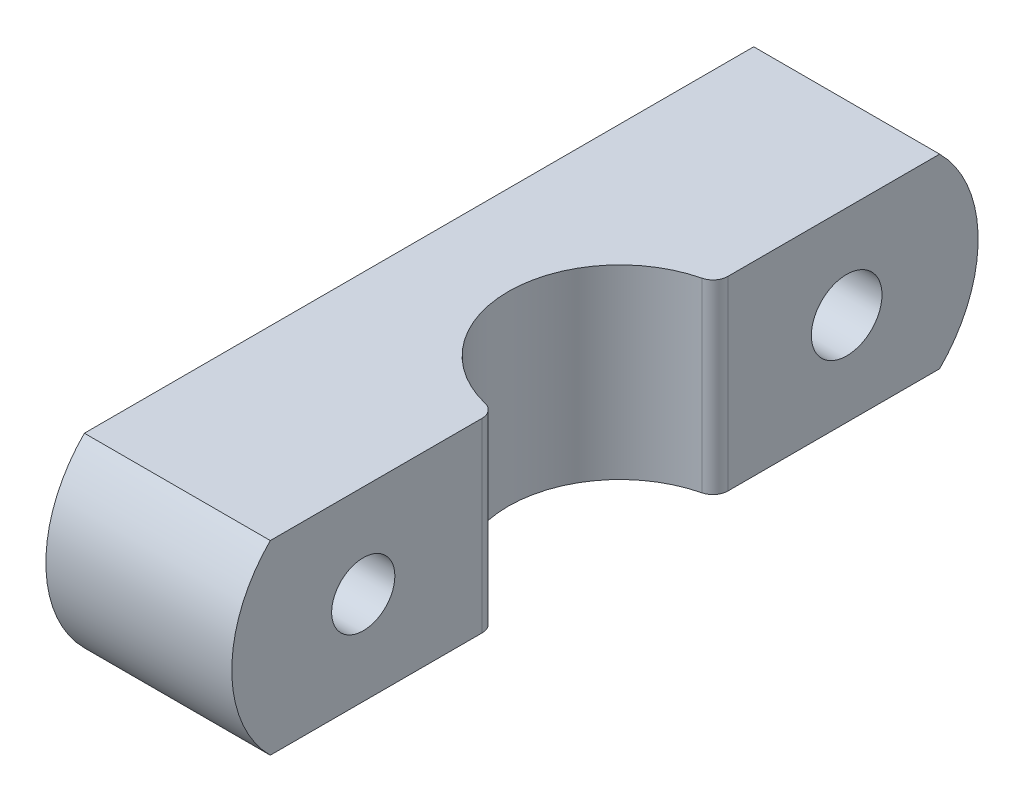
ISO-10303-21;
HEADER;
FILE_DESCRIPTION(('STEP AP214'),'2;1');
FILE_NAME('part.step','',(''),(''),'','','');
FILE_SCHEMA(('AUTOMOTIVE_DESIGN { 1 0 10303 214 1 1 1 1 }'));
ENDSEC;
DATA;
#1=APPLICATION_CONTEXT('core data for automotive mechanical design processes');
#2=APPLICATION_PROTOCOL_DEFINITION('international standard','automotive_design',2000,#1);
#3=PRODUCT_CONTEXT('',#1,'mechanical');
#4=PRODUCT('Part','Part','',(#3));
#5=PRODUCT_RELATED_PRODUCT_CATEGORY('part','',(#4));
#6=PRODUCT_DEFINITION_FORMATION('','',#4);
#7=PRODUCT_DEFINITION_CONTEXT('part definition',#1,'design');
#8=PRODUCT_DEFINITION('design','',#6,#7);
#9=PRODUCT_DEFINITION_SHAPE('','',#8);
#10=(LENGTH_UNIT() NAMED_UNIT(*) SI_UNIT(.MILLI.,.METRE.));
#11=(NAMED_UNIT(*) PLANE_ANGLE_UNIT() SI_UNIT($,.RADIAN.));
#12=(NAMED_UNIT(*) SI_UNIT($,.STERADIAN.) SOLID_ANGLE_UNIT());
#13=UNCERTAINTY_MEASURE_WITH_UNIT(LENGTH_MEASURE(1.E-05),#10,'distance_accuracy_value','');
#14=(GEOMETRIC_REPRESENTATION_CONTEXT(3) GLOBAL_UNCERTAINTY_ASSIGNED_CONTEXT((#13)) GLOBAL_UNIT_ASSIGNED_CONTEXT((#10,
#11,#12)) REPRESENTATION_CONTEXT('',''));
#15=CARTESIAN_POINT('',(0.,0.,0.));
#16=DIRECTION('',(0.,0.,1.));
#17=DIRECTION('',(1.,0.,0.));
#18=AXIS2_PLACEMENT_3D('',#15,#16,#17);
#19=CARTESIAN_POINT('',(10.,11.4117982626734,16.8358985756885));
#20=DIRECTION('',(1.,0.,0.));
#21=DIRECTION('',(0.,0.,-1.));
#22=AXIS2_PLACEMENT_3D('',#19,#20,#21);
#23=PLANE('',#22);
#24=CARTESIAN_POINT('',(10.,11.4117982626734,16.8358985756885));
#25=DIRECTION('',(1.,0.,0.));
#26=DIRECTION('',(0.,0.,-1.));
#27=AXIS2_PLACEMENT_3D('',#24,#25,#26);
#28=CIRCLE('',#27,1.7);
#29=CARTESIAN_POINT('',(10.,11.4117982626734,15.1358985756885));
#30=VERTEX_POINT('',#29);
#31=EDGE_CURVE('E237',#30,#30,#28,.T.);
#32=ORIENTED_EDGE('',*,*,#31,.F.);
#33=EDGE_LOOP('',(#32));
#34=FACE_BOUND('',#33,.T.);
#35=DIRECTION('',(0.,0.,-1.));
#36=VECTOR('',#35,1.);
#37=CARTESIAN_POINT('',(10.,6.41179826267341,21.8358985756885));
#38=LINE('',#37,#36);
#39=CARTESIAN_POINT('',(10.,6.41179826267341,21.8358985756885));
#40=VERTEX_POINT('',#39);
#41=CARTESIAN_POINT('',(10.,6.41179826267341,10.4449832324319));
#42=VERTEX_POINT('',#41);
#43=EDGE_CURVE('E167',#40,#42,#38,.T.);
#44=ORIENTED_EDGE('',*,*,#43,.T.);
#45=DIRECTION('',(0.,1.,0.));
#46=VECTOR('',#45,1.);
#47=CARTESIAN_POINT('',(10.,16.4117982626734,10.4449832324319));
#48=LINE('',#47,#46);
#49=CARTESIAN_POINT('',(10.,16.4117982626734,10.4449832324319));
#50=VERTEX_POINT('',#49);
#51=EDGE_CURVE('E62',#42,#50,#48,.T.);
#52=ORIENTED_EDGE('',*,*,#51,.T.);
#53=DIRECTION('',(0.,0.,1.));
#54=VECTOR('',#53,1.);
#55=CARTESIAN_POINT('',(10.,16.4117982626734,10.6358985756885));
#56=LINE('',#55,#54);
#57=CARTESIAN_POINT('',(10.,16.4117982626734,21.8358985756885));
#58=VERTEX_POINT('',#57);
#59=EDGE_CURVE('E103',#50,#58,#56,.T.);
#60=ORIENTED_EDGE('',*,*,#59,.T.);
#61=CARTESIAN_POINT('',(10.,11.4117982626734,16.8358985756885));
#62=DIRECTION('',(1.,0.,0.));
#63=DIRECTION('',(0.,0.,-1.));
#64=AXIS2_PLACEMENT_3D('',#61,#62,#63);
#65=CIRCLE('',#64,7.07106781186548);
#66=EDGE_CURVE('E105',#58,#40,#65,.T.);
#67=ORIENTED_EDGE('',*,*,#66,.T.);
#68=EDGE_LOOP('',(#44,#52,#60,#67));
#69=FACE_BOUND('',#68,.T.);
#70=ADVANCED_FACE('F38',(#34,#69),#23,.T.);
#71=CARTESIAN_POINT('',(10.,11.4117982626734,16.8358985756885));
#72=DIRECTION('',(-1.,0.,0.));
#73=DIRECTION('',(0.,0.,1.));
#74=AXIS2_PLACEMENT_3D('',#71,#72,#73);
#75=CYLINDRICAL_SURFACE('',#74,7.07106781186548);
#76=CARTESIAN_POINT('',(0.,11.4117982626734,16.8358985756885));
#77=DIRECTION('',(1.,0.,0.));
#78=DIRECTION('',(0.,0.,-1.));
#79=AXIS2_PLACEMENT_3D('',#76,#77,#78);
#80=CIRCLE('',#79,7.07106781186548);
#81=CARTESIAN_POINT('',(0.,16.4117982626734,21.8358985756885));
#82=VERTEX_POINT('',#81);
#83=CARTESIAN_POINT('',(0.,6.41179826267341,21.8358985756885));
#84=VERTEX_POINT('',#83);
#85=EDGE_CURVE('E161',#82,#84,#80,.T.);
#86=ORIENTED_EDGE('',*,*,#85,.T.);
#87=DIRECTION('',(-1.,0.,0.));
#88=VECTOR('',#87,1.);
#89=CARTESIAN_POINT('',(10.,6.41179826267341,21.8358985756885));
#90=LINE('',#89,#88);
#91=EDGE_CURVE('E119',#40,#84,#90,.T.);
#92=ORIENTED_EDGE('',*,*,#91,.F.);
#93=ORIENTED_EDGE('',*,*,#66,.F.);
#94=DIRECTION('',(-1.,0.,0.));
#95=VECTOR('',#94,1.);
#96=CARTESIAN_POINT('',(10.,16.4117982626734,21.8358985756885));
#97=LINE('',#96,#95);
#98=EDGE_CURVE('E117',#58,#82,#97,.T.);
#99=ORIENTED_EDGE('',*,*,#98,.T.);
#100=EDGE_LOOP('',(#86,#92,#93,#99));
#101=FACE_BOUND('',#100,.T.);
#102=ADVANCED_FACE('F116',(#101),#75,.T.);
#103=CARTESIAN_POINT('',(10.,6.41179826267341,-2.96410142431147));
#104=DIRECTION('',(0.,1.,0.));
#105=DIRECTION('',(0.,0.,1.));
#106=AXIS2_PLACEMENT_3D('',#103,#104,#105);
#107=PLANE('',#106);
#108=CARTESIAN_POINT('',(10.8,6.41179826267341,3.83589857568853));
#109=DIRECTION('',(0.,-1.,0.));
#110=DIRECTION('',(0.,0.,-1.));
#111=AXIS2_PLACEMENT_3D('',#108,#109,#110);
#112=CIRCLE('',#111,6.);
#113=CARTESIAN_POINT('',(9.38823529411765,6.41179826267341,9.66744386105028));
#114=VERTEX_POINT('',#113);
#115=CARTESIAN_POINT('',(9.38823529411765,6.41179826267341,-1.99564670967323));
#116=VERTEX_POINT('',#115);
#117=EDGE_CURVE('E162',#114,#116,#112,.T.);
#118=ORIENTED_EDGE('',*,*,#117,.F.);
#119=CARTESIAN_POINT('',(9.2,6.41179826267341,10.4449832324319));
#120=DIRECTION('',(0.,1.,0.));
#121=DIRECTION('',(0.,0.,1.));
#122=AXIS2_PLACEMENT_3D('',#119,#120,#121);
#123=CIRCLE('',#122,0.8);
#124=EDGE_CURVE('E144',#114,#42,#123,.F.);
#125=ORIENTED_EDGE('',*,*,#124,.T.);
#126=ORIENTED_EDGE('',*,*,#43,.F.);
#127=ORIENTED_EDGE('',*,*,#91,.T.);
#128=DIRECTION('',(0.,0.,-1.));
#129=VECTOR('',#128,1.);
#130=CARTESIAN_POINT('',(0.,6.41179826267341,-2.96410142431147));
#131=LINE('',#130,#129);
#132=CARTESIAN_POINT('',(0.,6.41179826267341,-14.1641014243115));
#133=VERTEX_POINT('',#132);
#134=EDGE_CURVE('E179',#84,#133,#131,.T.);
#135=ORIENTED_EDGE('',*,*,#134,.T.);
#136=DIRECTION('',(-1.,0.,0.));
#137=VECTOR('',#136,1.);
#138=CARTESIAN_POINT('',(10.,6.41179826267341,-14.1641014243115));
#139=LINE('',#138,#137);
#140=CARTESIAN_POINT('',(10.,6.41179826267341,-14.1641014243115));
#141=VERTEX_POINT('',#140);
#142=EDGE_CURVE('E134',#141,#133,#139,.T.);
#143=ORIENTED_EDGE('',*,*,#142,.F.);
#144=CARTESIAN_POINT('',(10.,6.41179826267341,-2.7731860810548));
#145=VERTEX_POINT('',#144);
#146=EDGE_CURVE('E122',#145,#141,#38,.T.);
#147=ORIENTED_EDGE('',*,*,#146,.F.);
#148=CARTESIAN_POINT('',(9.2,6.41179826267341,-2.77318608105479));
#149=DIRECTION('',(0.,1.,0.));
#150=DIRECTION('',(0.,0.,1.));
#151=AXIS2_PLACEMENT_3D('',#148,#149,#150);
#152=CIRCLE('',#151,0.8);
#153=EDGE_CURVE('E141',#145,#116,#152,.F.);
#154=ORIENTED_EDGE('',*,*,#153,.T.);
#155=EDGE_LOOP('',(#118,#125,#126,#127,#135,#143,#147,#154));
#156=FACE_BOUND('',#155,.T.);
#157=ADVANCED_FACE('F166',(#156),#107,.F.);
#158=CARTESIAN_POINT('',(10.,11.4117982626734,-9.16410142431147));
#159=DIRECTION('',(-1.,0.,0.));
#160=DIRECTION('',(0.,0.,1.));
#161=AXIS2_PLACEMENT_3D('',#158,#159,#160);
#162=CYLINDRICAL_SURFACE('',#161,7.07106781186548);
#163=CARTESIAN_POINT('',(0.,11.4117982626734,-9.16410142431147));
#164=DIRECTION('',(1.,0.,0.));
#165=DIRECTION('',(0.,0.,-1.));
#166=AXIS2_PLACEMENT_3D('',#163,#164,#165);
#167=CIRCLE('',#166,7.07106781186548);
#168=CARTESIAN_POINT('',(0.,16.4117982626734,-14.1641014243115));
#169=VERTEX_POINT('',#168);
#170=EDGE_CURVE('E182',#133,#169,#167,.T.);
#171=ORIENTED_EDGE('',*,*,#170,.T.);
#172=DIRECTION('',(-1.,0.,0.));
#173=VECTOR('',#172,1.);
#174=CARTESIAN_POINT('',(10.,16.4117982626734,-14.1641014243115));
#175=LINE('',#174,#173);
#176=CARTESIAN_POINT('',(10.,16.4117982626734,-14.1641014243115));
#177=VERTEX_POINT('',#176);
#178=EDGE_CURVE('E174',#177,#169,#175,.T.);
#179=ORIENTED_EDGE('',*,*,#178,.F.);
#180=CARTESIAN_POINT('',(10.,11.4117982626734,-9.16410142431147));
#181=DIRECTION('',(1.,0.,0.));
#182=DIRECTION('',(0.,0.,-1.));
#183=AXIS2_PLACEMENT_3D('',#180,#181,#182);
#184=CIRCLE('',#183,7.07106781186548);
#185=EDGE_CURVE('E169',#141,#177,#184,.T.);
#186=ORIENTED_EDGE('',*,*,#185,.F.);
#187=ORIENTED_EDGE('',*,*,#142,.T.);
#188=EDGE_LOOP('',(#171,#179,#186,#187));
#189=FACE_BOUND('',#188,.T.);
#190=ADVANCED_FACE('F195',(#189),#162,.T.);
#191=CARTESIAN_POINT('',(10.,16.4117982626734,10.6358985756885));
#192=DIRECTION('',(0.,1.,0.));
#193=DIRECTION('',(0.,0.,1.));
#194=AXIS2_PLACEMENT_3D('',#191,#192,#193);
#195=PLANE('',#194);
#196=ORIENTED_EDGE('',*,*,#59,.F.);
#197=CARTESIAN_POINT('',(9.2,16.4117982626734,10.4449832324319));
#198=DIRECTION('',(0.,1.,0.));
#199=DIRECTION('',(0.,0.,1.));
#200=AXIS2_PLACEMENT_3D('',#197,#198,#199);
#201=CIRCLE('',#200,0.8);
#202=CARTESIAN_POINT('',(9.38823529411765,16.4117982626734,9.66744386105028));
#203=VERTEX_POINT('',#202);
#204=EDGE_CURVE('E47',#50,#203,#201,.T.);
#205=ORIENTED_EDGE('',*,*,#204,.T.);
#206=CARTESIAN_POINT('',(10.8,16.4117982626734,3.83589857568853));
#207=DIRECTION('',(0.,-1.,0.));
#208=DIRECTION('',(0.,0.,-1.));
#209=AXIS2_PLACEMENT_3D('',#206,#207,#208);
#210=CIRCLE('',#209,6.);
#211=CARTESIAN_POINT('',(9.38823529411765,16.4117982626734,-1.99564670967323));
#212=VERTEX_POINT('',#211);
#213=EDGE_CURVE('E152',#203,#212,#210,.T.);
#214=ORIENTED_EDGE('',*,*,#213,.T.);
#215=CARTESIAN_POINT('',(9.2,16.4117982626734,-2.77318608105479));
#216=DIRECTION('',(0.,1.,0.));
#217=DIRECTION('',(0.,0.,1.));
#218=AXIS2_PLACEMENT_3D('',#215,#216,#217);
#219=CIRCLE('',#218,0.8);
#220=CARTESIAN_POINT('',(10.,16.4117982626734,-2.77318608105479));
#221=VERTEX_POINT('',#220);
#222=EDGE_CURVE('E54',#212,#221,#219,.T.);
#223=ORIENTED_EDGE('',*,*,#222,.T.);
#224=EDGE_CURVE('E110',#177,#221,#56,.T.);
#225=ORIENTED_EDGE('',*,*,#224,.F.);
#226=ORIENTED_EDGE('',*,*,#178,.T.);
#227=DIRECTION('',(0.,0.,-1.));
#228=VECTOR('',#227,1.);
#229=CARTESIAN_POINT('',(0.,16.4117982626734,10.6358985756885));
#230=LINE('',#229,#228);
#231=EDGE_CURVE('E111',#82,#169,#230,.T.);
#232=ORIENTED_EDGE('',*,*,#231,.F.);
#233=ORIENTED_EDGE('',*,*,#98,.F.);
#234=EDGE_LOOP('',(#196,#205,#214,#223,#225,#226,#232,#233));
#235=FACE_BOUND('',#234,.T.);
#236=ADVANCED_FACE('F124',(#235),#195,.T.);
#237=CARTESIAN_POINT('',(10.,11.4117982626734,-9.16410142431147));
#238=DIRECTION('',(1.,0.,0.));
#239=DIRECTION('',(0.,0.,-1.));
#240=AXIS2_PLACEMENT_3D('',#237,#238,#239);
#241=CIRCLE('',#240,1.90000000000001);
#242=CARTESIAN_POINT('',(10.,11.4117982626734,-11.0641014243115));
#243=VERTEX_POINT('',#242);
#244=EDGE_CURVE('E245',#243,#243,#241,.T.);
#245=ORIENTED_EDGE('',*,*,#244,.F.);
#246=EDGE_LOOP('',(#245));
#247=FACE_BOUND('',#246,.T.);
#248=ORIENTED_EDGE('',*,*,#224,.T.);
#249=DIRECTION('',(0.,1.,0.));
#250=VECTOR('',#249,1.);
#251=CARTESIAN_POINT('',(10.,6.41179826267341,-2.77318608105479));
#252=LINE('',#251,#250);
#253=EDGE_CURVE('E11',#221,#145,#252,.F.);
#254=ORIENTED_EDGE('',*,*,#253,.T.);
#255=ORIENTED_EDGE('',*,*,#146,.T.);
#256=ORIENTED_EDGE('',*,*,#185,.T.);
#257=EDGE_LOOP('',(#248,#254,#255,#256));
#258=FACE_BOUND('',#257,.T.);
#259=ADVANCED_FACE('F201',(#247,#258),#23,.T.);
#260=CARTESIAN_POINT('',(0.,11.4117982626734,16.8358985756885));
#261=DIRECTION('',(1.,0.,0.));
#262=DIRECTION('',(0.,0.,-1.));
#263=AXIS2_PLACEMENT_3D('',#260,#261,#262);
#264=PLANE('',#263);
#265=CARTESIAN_POINT('',(0.,11.4117982626734,16.8358985756885));
#266=DIRECTION('',(1.,0.,0.));
#267=DIRECTION('',(0.,0.,-1.));
#268=AXIS2_PLACEMENT_3D('',#265,#266,#267);
#269=CIRCLE('',#268,1.7);
#270=CARTESIAN_POINT('',(0.,11.4117982626734,15.1358985756885));
#271=VERTEX_POINT('',#270);
#272=EDGE_CURVE('E235',#271,#271,#269,.T.);
#273=ORIENTED_EDGE('',*,*,#272,.T.);
#274=EDGE_LOOP('',(#273));
#275=FACE_BOUND('',#274,.T.);
#276=CARTESIAN_POINT('',(0.,11.4117982626734,-9.16410142431147));
#277=DIRECTION('',(1.,0.,0.));
#278=DIRECTION('',(0.,0.,-1.));
#279=AXIS2_PLACEMENT_3D('',#276,#277,#278);
#280=CIRCLE('',#279,1.90000000000001);
#281=CARTESIAN_POINT('',(0.,11.4117982626734,-11.0641014243115));
#282=VERTEX_POINT('',#281);
#283=EDGE_CURVE('E239',#282,#282,#280,.T.);
#284=ORIENTED_EDGE('',*,*,#283,.T.);
#285=EDGE_LOOP('',(#284));
#286=FACE_BOUND('',#285,.T.);
#287=ORIENTED_EDGE('',*,*,#85,.F.);
#288=ORIENTED_EDGE('',*,*,#231,.T.);
#289=ORIENTED_EDGE('',*,*,#170,.F.);
#290=ORIENTED_EDGE('',*,*,#134,.F.);
#291=EDGE_LOOP('',(#287,#288,#289,#290));
#292=FACE_BOUND('',#291,.T.);
#293=ADVANCED_FACE('F199',(#275,#286,#292),#264,.F.);
#294=CARTESIAN_POINT('',(10.8,16.4117982626734,3.83589857568853));
#295=DIRECTION('',(0.,-1.,0.));
#296=DIRECTION('',(0.,0.,-1.));
#297=AXIS2_PLACEMENT_3D('',#294,#295,#296);
#298=CYLINDRICAL_SURFACE('',#297,6.);
#299=ORIENTED_EDGE('',*,*,#213,.F.);
#300=DIRECTION('',(0.,-1.,0.));
#301=VECTOR('',#300,1.);
#302=CARTESIAN_POINT('',(9.38823529411765,16.4117982626734,9.66744386105028));
#303=LINE('',#302,#301);
#304=EDGE_CURVE('E132',#203,#114,#303,.T.);
#305=ORIENTED_EDGE('',*,*,#304,.T.);
#306=ORIENTED_EDGE('',*,*,#117,.T.);
#307=DIRECTION('',(0.,-1.,0.));
#308=VECTOR('',#307,1.);
#309=CARTESIAN_POINT('',(9.38823529411765,16.4117982626734,-1.99564670967323));
#310=LINE('',#309,#308);
#311=EDGE_CURVE('E128',#116,#212,#310,.F.);
#312=ORIENTED_EDGE('',*,*,#311,.T.);
#313=EDGE_LOOP('',(#299,#305,#306,#312));
#314=FACE_BOUND('',#313,.T.);
#315=ADVANCED_FACE('F156',(#314),#298,.F.);
#316=CARTESIAN_POINT('',(9.2,16.4117982626734,10.4449832324319));
#317=DIRECTION('',(0.,-1.,0.));
#318=DIRECTION('',(0.,0.,-1.));
#319=AXIS2_PLACEMENT_3D('',#316,#317,#318);
#320=CYLINDRICAL_SURFACE('',#319,0.8);
#321=ORIENTED_EDGE('',*,*,#204,.F.);
#322=ORIENTED_EDGE('',*,*,#51,.F.);
#323=ORIENTED_EDGE('',*,*,#124,.F.);
#324=ORIENTED_EDGE('',*,*,#304,.F.);
#325=EDGE_LOOP('',(#321,#322,#323,#324));
#326=FACE_BOUND('',#325,.T.);
#327=ADVANCED_FACE('F164',(#326),#320,.T.);
#328=CARTESIAN_POINT('',(9.2,16.4117982626734,-2.77318608105479));
#329=DIRECTION('',(0.,-1.,0.));
#330=DIRECTION('',(0.,0.,-1.));
#331=AXIS2_PLACEMENT_3D('',#328,#329,#330);
#332=CYLINDRICAL_SURFACE('',#331,0.8);
#333=ORIENTED_EDGE('',*,*,#222,.F.);
#334=ORIENTED_EDGE('',*,*,#311,.F.);
#335=ORIENTED_EDGE('',*,*,#153,.F.);
#336=ORIENTED_EDGE('',*,*,#253,.F.);
#337=EDGE_LOOP('',(#333,#334,#335,#336));
#338=FACE_BOUND('',#337,.T.);
#339=ADVANCED_FACE('F40',(#338),#332,.T.);
#340=CARTESIAN_POINT('',(0.,11.4117982626734,-9.16410142431147));
#341=DIRECTION('',(1.,0.,0.));
#342=DIRECTION('',(0.,0.,-1.));
#343=AXIS2_PLACEMENT_3D('',#340,#341,#342);
#344=CYLINDRICAL_SURFACE('',#343,1.90000000000001);
#345=ORIENTED_EDGE('',*,*,#283,.F.);
#346=EDGE_LOOP('',(#345));
#347=FACE_BOUND('',#346,.T.);
#348=ORIENTED_EDGE('',*,*,#244,.T.);
#349=EDGE_LOOP('',(#348));
#350=FACE_BOUND('',#349,.T.);
#351=ADVANCED_FACE('F224',(#347,#350),#344,.F.);
#352=CARTESIAN_POINT('',(0.,11.4117982626734,16.8358985756885));
#353=DIRECTION('',(1.,0.,0.));
#354=DIRECTION('',(0.,0.,-1.));
#355=AXIS2_PLACEMENT_3D('',#352,#353,#354);
#356=CYLINDRICAL_SURFACE('',#355,1.7);
#357=ORIENTED_EDGE('',*,*,#272,.F.);
#358=EDGE_LOOP('',(#357));
#359=FACE_BOUND('',#358,.T.);
#360=ORIENTED_EDGE('',*,*,#31,.T.);
#361=EDGE_LOOP('',(#360));
#362=FACE_BOUND('',#361,.T.);
#363=ADVANCED_FACE('F227',(#359,#362),#356,.F.);
#364=CLOSED_SHELL('',(#70,#102,#157,#190,#236,#259,#293,#315,#327,#339,#351,#363));
#365=MANIFOLD_SOLID_BREP('B2',#364);
#366=ADVANCED_BREP_SHAPE_REPRESENTATION('',(#18,#365),#14);
#367=SHAPE_DEFINITION_REPRESENTATION(#9,#366);
ENDSEC;
END-ISO-10303-21;
